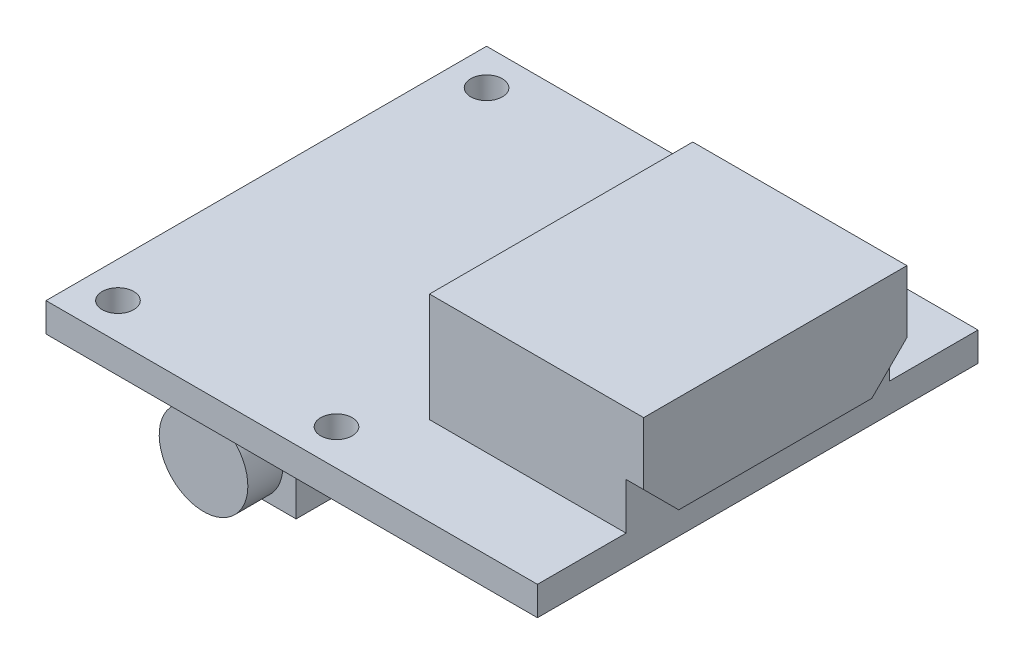
ISO-10303-21;
HEADER;
FILE_DESCRIPTION(('STEP AP214'),'2;1');
FILE_NAME('part.step','',(''),(''),'','','');
FILE_SCHEMA(('AUTOMOTIVE_DESIGN { 1 0 10303 214 1 1 1 1 }'));
ENDSEC;
DATA;
#1=APPLICATION_CONTEXT('core data for automotive mechanical design processes');
#2=APPLICATION_PROTOCOL_DEFINITION('international standard','automotive_design',2000,#1);
#3=PRODUCT_CONTEXT('',#1,'mechanical');
#4=PRODUCT('Part','Part','',(#3));
#5=PRODUCT_RELATED_PRODUCT_CATEGORY('part','',(#4));
#6=PRODUCT_DEFINITION_FORMATION('','',#4);
#7=PRODUCT_DEFINITION_CONTEXT('part definition',#1,'design');
#8=PRODUCT_DEFINITION('design','',#6,#7);
#9=PRODUCT_DEFINITION_SHAPE('','',#8);
#10=(LENGTH_UNIT() NAMED_UNIT(*) SI_UNIT(.MILLI.,.METRE.));
#11=(NAMED_UNIT(*) PLANE_ANGLE_UNIT() SI_UNIT($,.RADIAN.));
#12=(NAMED_UNIT(*) SI_UNIT($,.STERADIAN.) SOLID_ANGLE_UNIT());
#13=UNCERTAINTY_MEASURE_WITH_UNIT(LENGTH_MEASURE(1.E-05),#10,'distance_accuracy_value','');
#14=(GEOMETRIC_REPRESENTATION_CONTEXT(3) GLOBAL_UNCERTAINTY_ASSIGNED_CONTEXT((#13)) GLOBAL_UNIT_ASSIGNED_CONTEXT((#10,
#11,#12)) REPRESENTATION_CONTEXT('',''));
#15=CARTESIAN_POINT('',(0.,0.,0.));
#16=DIRECTION('',(0.,0.,1.));
#17=DIRECTION('',(1.,0.,0.));
#18=AXIS2_PLACEMENT_3D('',#15,#16,#17);
#19=CARTESIAN_POINT('',(0.,0.,0.));
#20=DIRECTION('',(0.,-1.,0.));
#21=DIRECTION('',(0.,0.,-1.));
#22=AXIS2_PLACEMENT_3D('',#19,#20,#21);
#23=PLANE('',#22);
#24=CARTESIAN_POINT('',(-11.95,0.,10.5));
#25=DIRECTION('',(0.,-1.,0.));
#26=DIRECTION('',(0.,0.,-1.));
#27=AXIS2_PLACEMENT_3D('',#24,#25,#26);
#28=CIRCLE('',#27,0.9);
#29=CARTESIAN_POINT('',(-11.95,0.,9.59999999999999));
#30=VERTEX_POINT('',#29);
#31=EDGE_CURVE('E601',#30,#30,#28,.T.);
#32=ORIENTED_EDGE('',*,*,#31,.F.);
#33=EDGE_LOOP('',(#32));
#34=FACE_BOUND('',#33,.T.);
#35=CARTESIAN_POINT('',(0.500000000000002,0.,-10.5));
#36=DIRECTION('',(0.,-1.,0.));
#37=DIRECTION('',(0.,0.,-1.));
#38=AXIS2_PLACEMENT_3D('',#35,#36,#37);
#39=CIRCLE('',#38,0.899999999999999);
#40=CARTESIAN_POINT('',(0.500000000000002,0.,-11.4));
#41=VERTEX_POINT('',#40);
#42=EDGE_CURVE('E598',#41,#41,#39,.T.);
#43=ORIENTED_EDGE('',*,*,#42,.F.);
#44=EDGE_LOOP('',(#43));
#45=FACE_BOUND('',#44,.T.);
#46=CARTESIAN_POINT('',(0.500000000000002,0.,10.5));
#47=DIRECTION('',(0.,-1.,0.));
#48=DIRECTION('',(0.,0.,-1.));
#49=AXIS2_PLACEMENT_3D('',#46,#47,#48);
#50=CIRCLE('',#49,0.9);
#51=CARTESIAN_POINT('',(0.500000000000002,0.,9.6));
#52=VERTEX_POINT('',#51);
#53=EDGE_CURVE('E591',#52,#52,#50,.T.);
#54=ORIENTED_EDGE('',*,*,#53,.F.);
#55=EDGE_LOOP('',(#54));
#56=FACE_BOUND('',#55,.T.);
#57=CARTESIAN_POINT('',(-11.95,0.,-10.5));
#58=DIRECTION('',(0.,-1.,0.));
#59=DIRECTION('',(0.,0.,-1.));
#60=AXIS2_PLACEMENT_3D('',#57,#58,#59);
#61=CIRCLE('',#60,0.9);
#62=CARTESIAN_POINT('',(-11.95,0.,-11.4));
#63=VERTEX_POINT('',#62);
#64=EDGE_CURVE('E302',#63,#63,#61,.T.);
#65=ORIENTED_EDGE('',*,*,#64,.F.);
#66=EDGE_LOOP('',(#65));
#67=FACE_BOUND('',#66,.T.);
#68=DIRECTION('',(0.,0.,-1.));
#69=VECTOR('',#68,1.);
#70=CARTESIAN_POINT('',(14.,0.,12.55));
#71=LINE('',#70,#69);
#72=CARTESIAN_POINT('',(14.,0.,12.55));
#73=VERTEX_POINT('',#72);
#74=CARTESIAN_POINT('',(14.,0.,-12.55));
#75=VERTEX_POINT('',#74);
#76=EDGE_CURVE('E268',#73,#75,#71,.T.);
#77=ORIENTED_EDGE('',*,*,#76,.F.);
#78=DIRECTION('',(1.,0.,0.));
#79=VECTOR('',#78,1.);
#80=CARTESIAN_POINT('',(-14.,0.,12.55));
#81=LINE('',#80,#79);
#82=CARTESIAN_POINT('',(-14.,0.,12.55));
#83=VERTEX_POINT('',#82);
#84=EDGE_CURVE('E286',#83,#73,#81,.T.);
#85=ORIENTED_EDGE('',*,*,#84,.F.);
#86=DIRECTION('',(0.,0.,1.));
#87=VECTOR('',#86,1.);
#88=CARTESIAN_POINT('',(-14.,0.,12.55));
#89=LINE('',#88,#87);
#90=CARTESIAN_POINT('',(-14.,0.,-12.55));
#91=VERTEX_POINT('',#90);
#92=EDGE_CURVE('E284',#91,#83,#89,.T.);
#93=ORIENTED_EDGE('',*,*,#92,.F.);
#94=DIRECTION('',(-1.,0.,0.));
#95=VECTOR('',#94,1.);
#96=CARTESIAN_POINT('',(-14.,0.,-12.55));
#97=LINE('',#96,#95);
#98=EDGE_CURVE('E282',#75,#91,#97,.T.);
#99=ORIENTED_EDGE('',*,*,#98,.F.);
#100=EDGE_LOOP('',(#77,#85,#93,#99));
#101=FACE_BOUND('',#100,.T.);
#102=DIRECTION('',(-1.,0.,0.));
#103=VECTOR('',#102,1.);
#104=CARTESIAN_POINT('',(-8.8,0.,10.05));
#105=LINE('',#104,#103);
#106=CARTESIAN_POINT('',(-6.67091666363659,0.,10.05));
#107=VERTEX_POINT('',#106);
#108=CARTESIAN_POINT('',(-8.8,0.,10.05));
#109=VERTEX_POINT('',#108);
#110=EDGE_CURVE('E188',#107,#109,#105,.T.);
#111=ORIENTED_EDGE('',*,*,#110,.F.);
#112=DIRECTION('',(0.,0.,-1.));
#113=VECTOR('',#112,1.);
#114=CARTESIAN_POINT('',(-6.67091666363659,0.,12.05));
#115=LINE('',#114,#113);
#116=CARTESIAN_POINT('',(-6.67091666363659,0.,12.05));
#117=VERTEX_POINT('',#116);
#118=EDGE_CURVE('E183',#107,#117,#115,.F.);
#119=ORIENTED_EDGE('',*,*,#118,.T.);
#120=DIRECTION('',(-1.,0.,0.));
#121=VECTOR('',#120,1.);
#122=CARTESIAN_POINT('',(0.,0.,12.05));
#123=LINE('',#122,#121);
#124=CARTESIAN_POINT('',(-4.37908333636342,0.,12.05));
#125=VERTEX_POINT('',#124);
#126=EDGE_CURVE('E11',#125,#117,#123,.T.);
#127=ORIENTED_EDGE('',*,*,#126,.F.);
#128=DIRECTION('',(0.,0.,-1.));
#129=VECTOR('',#128,1.);
#130=CARTESIAN_POINT('',(-4.37908333636342,0.,12.05));
#131=LINE('',#130,#129);
#132=CARTESIAN_POINT('',(-4.37908333636342,0.,10.05));
#133=VERTEX_POINT('',#132);
#134=EDGE_CURVE('E171',#125,#133,#131,.T.);
#135=ORIENTED_EDGE('',*,*,#134,.T.);
#136=CARTESIAN_POINT('',(-2.25,0.,10.05));
#137=VERTEX_POINT('',#136);
#138=EDGE_CURVE('E181',#137,#133,#105,.T.);
#139=ORIENTED_EDGE('',*,*,#138,.F.);
#140=DIRECTION('',(0.,0.,1.));
#141=VECTOR('',#140,1.);
#142=CARTESIAN_POINT('',(-2.25,0.,10.05));
#143=LINE('',#142,#141);
#144=CARTESIAN_POINT('',(-2.25,0.,-1.9));
#145=VERTEX_POINT('',#144);
#146=EDGE_CURVE('E193',#145,#137,#143,.T.);
#147=ORIENTED_EDGE('',*,*,#146,.F.);
#148=DIRECTION('',(1.,0.,0.));
#149=VECTOR('',#148,1.);
#150=CARTESIAN_POINT('',(-8.8,0.,-1.9));
#151=LINE('',#150,#149);
#152=CARTESIAN_POINT('',(-8.8,0.,-1.9));
#153=VERTEX_POINT('',#152);
#154=EDGE_CURVE('E617',#153,#145,#151,.T.);
#155=ORIENTED_EDGE('',*,*,#154,.F.);
#156=DIRECTION('',(0.,0.,-1.));
#157=VECTOR('',#156,1.);
#158=CARTESIAN_POINT('',(-8.8,0.,10.05));
#159=LINE('',#158,#157);
#160=EDGE_CURVE('E608',#109,#153,#159,.T.);
#161=ORIENTED_EDGE('',*,*,#160,.F.);
#162=EDGE_LOOP('',(#111,#119,#127,#135,#139,#147,#155,#161));
#163=FACE_BOUND('',#162,.T.);
#164=ADVANCED_FACE('F34',(#34,#45,#56,#67,#101,#163),#23,.T.);
#165=CARTESIAN_POINT('',(-8.8,-4.5,10.05));
#166=DIRECTION('',(0.,0.,-1.));
#167=DIRECTION('',(-1.,0.,0.));
#168=AXIS2_PLACEMENT_3D('',#165,#166,#167);
#169=PLANE('',#168);
#170=CARTESIAN_POINT('',(-5.525,-2.25,10.05));
#171=DIRECTION('',(0.,0.,1.));
#172=DIRECTION('',(1.,0.,0.));
#173=AXIS2_PLACEMENT_3D('',#170,#171,#172);
#174=CIRCLE('',#173,2.525);
#175=CARTESIAN_POINT('',(-4.37908333636342,-4.5,10.05));
#176=VERTEX_POINT('',#175);
#177=EDGE_CURVE('E167',#176,#133,#174,.T.);
#178=ORIENTED_EDGE('',*,*,#177,.F.);
#179=DIRECTION('',(-1.,0.,0.));
#180=VECTOR('',#179,1.);
#181=CARTESIAN_POINT('',(-8.8,-4.5,10.05));
#182=LINE('',#181,#180);
#183=CARTESIAN_POINT('',(-2.25,-4.5,10.05));
#184=VERTEX_POINT('',#183);
#185=EDGE_CURVE('E200',#184,#176,#182,.T.);
#186=ORIENTED_EDGE('',*,*,#185,.F.);
#187=DIRECTION('',(0.,1.,0.));
#188=VECTOR('',#187,1.);
#189=CARTESIAN_POINT('',(-2.25,-4.5,10.05));
#190=LINE('',#189,#188);
#191=EDGE_CURVE('E59',#184,#137,#190,.T.);
#192=ORIENTED_EDGE('',*,*,#191,.T.);
#193=ORIENTED_EDGE('',*,*,#138,.T.);
#194=EDGE_LOOP('',(#178,#186,#192,#193));
#195=FACE_BOUND('',#194,.T.);
#196=ADVANCED_FACE('F186',(#195),#169,.F.);
#197=CARTESIAN_POINT('',(14.,1.65,12.55));
#198=DIRECTION('',(-1.,0.,0.));
#199=DIRECTION('',(0.,0.,1.));
#200=AXIS2_PLACEMENT_3D('',#197,#198,#199);
#201=PLANE('',#200);
#202=DIRECTION('',(0.,-0.707106781186549,-0.707106781186546));
#203=VECTOR('',#202,1.);
#204=CARTESIAN_POINT('',(14.,4.30000000000001,7.5));
#205=LINE('',#204,#203);
#206=CARTESIAN_POINT('',(14.,4.3,7.5));
#207=VERTEX_POINT('',#206);
#208=CARTESIAN_POINT('',(14.,2.3,5.5));
#209=VERTEX_POINT('',#208);
#210=EDGE_CURVE('E207',#207,#209,#205,.T.);
#211=ORIENTED_EDGE('',*,*,#210,.F.);
#212=DIRECTION('',(0.,-1.,0.));
#213=VECTOR('',#212,1.);
#214=CARTESIAN_POINT('',(14.,7.85,7.5));
#215=LINE('',#214,#213);
#216=CARTESIAN_POINT('',(14.,1.65,7.5));
#217=VERTEX_POINT('',#216);
#218=EDGE_CURVE('E251',#207,#217,#215,.T.);
#219=ORIENTED_EDGE('',*,*,#218,.T.);
#220=DIRECTION('',(0.,0.,-1.));
#221=VECTOR('',#220,1.);
#222=CARTESIAN_POINT('',(14.,1.65,12.55));
#223=LINE('',#222,#221);
#224=CARTESIAN_POINT('',(14.,1.65,12.55));
#225=VERTEX_POINT('',#224);
#226=EDGE_CURVE('E269',#225,#217,#223,.T.);
#227=ORIENTED_EDGE('',*,*,#226,.F.);
#228=DIRECTION('',(0.,-1.,0.));
#229=VECTOR('',#228,1.);
#230=CARTESIAN_POINT('',(14.,1.65,12.55));
#231=LINE('',#230,#229);
#232=EDGE_CURVE('E279',#225,#73,#231,.T.);
#233=ORIENTED_EDGE('',*,*,#232,.T.);
#234=ORIENTED_EDGE('',*,*,#76,.T.);
#235=DIRECTION('',(0.,-1.,0.));
#236=VECTOR('',#235,1.);
#237=CARTESIAN_POINT('',(14.,1.65,-12.55));
#238=LINE('',#237,#236);
#239=CARTESIAN_POINT('',(14.,1.65,-12.55));
#240=VERTEX_POINT('',#239);
#241=EDGE_CURVE('E43',#240,#75,#238,.T.);
#242=ORIENTED_EDGE('',*,*,#241,.F.);
#243=CARTESIAN_POINT('',(14.,1.65,-7.5));
#244=VERTEX_POINT('',#243);
#245=EDGE_CURVE('E273',#244,#240,#223,.T.);
#246=ORIENTED_EDGE('',*,*,#245,.F.);
#247=DIRECTION('',(0.,-1.,0.));
#248=VECTOR('',#247,1.);
#249=CARTESIAN_POINT('',(14.,7.85,-7.5));
#250=LINE('',#249,#248);
#251=CARTESIAN_POINT('',(14.,4.3,-7.5));
#252=VERTEX_POINT('',#251);
#253=EDGE_CURVE('E266',#252,#244,#250,.T.);
#254=ORIENTED_EDGE('',*,*,#253,.F.);
#255=DIRECTION('',(0.,0.707106781186549,-0.707106781186546));
#256=VECTOR('',#255,1.);
#257=CARTESIAN_POINT('',(14.,2.3,-5.5));
#258=LINE('',#257,#256);
#259=CARTESIAN_POINT('',(14.,2.3,-5.5));
#260=VERTEX_POINT('',#259);
#261=EDGE_CURVE('E212',#260,#252,#258,.T.);
#262=ORIENTED_EDGE('',*,*,#261,.F.);
#263=DIRECTION('',(0.,0.,-1.));
#264=VECTOR('',#263,1.);
#265=CARTESIAN_POINT('',(14.,2.3,5.5));
#266=LINE('',#265,#264);
#267=EDGE_CURVE('E227',#209,#260,#266,.T.);
#268=ORIENTED_EDGE('',*,*,#267,.F.);
#269=EDGE_LOOP('',(#211,#219,#227,#233,#234,#242,#246,#254,#262,#268));
#270=FACE_BOUND('',#269,.T.);
#271=ADVANCED_FACE('F36',(#270),#201,.F.);
#272=CARTESIAN_POINT('',(0.,1.65,0.));
#273=DIRECTION('',(0.,-1.,0.));
#274=DIRECTION('',(0.,0.,-1.));
#275=AXIS2_PLACEMENT_3D('',#272,#273,#274);
#276=PLANE('',#275);
#277=CARTESIAN_POINT('',(-11.95,1.65,10.5));
#278=DIRECTION('',(0.,-1.,0.));
#279=DIRECTION('',(0.,0.,-1.));
#280=AXIS2_PLACEMENT_3D('',#277,#278,#279);
#281=CIRCLE('',#280,0.9);
#282=CARTESIAN_POINT('',(-11.95,1.65,9.59999999999999));
#283=VERTEX_POINT('',#282);
#284=EDGE_CURVE('E38',#283,#283,#281,.T.);
#285=ORIENTED_EDGE('',*,*,#284,.T.);
#286=EDGE_LOOP('',(#285));
#287=FACE_BOUND('',#286,.T.);
#288=CARTESIAN_POINT('',(0.500000000000002,1.65,-10.5));
#289=DIRECTION('',(0.,-1.,0.));
#290=DIRECTION('',(0.,0.,-1.));
#291=AXIS2_PLACEMENT_3D('',#288,#289,#290);
#292=CIRCLE('',#291,0.899999999999999);
#293=CARTESIAN_POINT('',(0.500000000000002,1.65,-11.4));
#294=VERTEX_POINT('',#293);
#295=EDGE_CURVE('E304',#294,#294,#292,.T.);
#296=ORIENTED_EDGE('',*,*,#295,.T.);
#297=EDGE_LOOP('',(#296));
#298=FACE_BOUND('',#297,.T.);
#299=CARTESIAN_POINT('',(0.500000000000002,1.65,10.5));
#300=DIRECTION('',(0.,-1.,0.));
#301=DIRECTION('',(0.,0.,-1.));
#302=AXIS2_PLACEMENT_3D('',#299,#300,#301);
#303=CIRCLE('',#302,0.9);
#304=CARTESIAN_POINT('',(0.500000000000002,1.65,9.6));
#305=VERTEX_POINT('',#304);
#306=EDGE_CURVE('E301',#305,#305,#303,.T.);
#307=ORIENTED_EDGE('',*,*,#306,.T.);
#308=EDGE_LOOP('',(#307));
#309=FACE_BOUND('',#308,.T.);
#310=CARTESIAN_POINT('',(-11.95,1.65,-10.5));
#311=DIRECTION('',(0.,-1.,0.));
#312=DIRECTION('',(0.,0.,-1.));
#313=AXIS2_PLACEMENT_3D('',#310,#311,#312);
#314=CIRCLE('',#313,0.9);
#315=CARTESIAN_POINT('',(-11.95,1.65,-11.4));
#316=VERTEX_POINT('',#315);
#317=EDGE_CURVE('E298',#316,#316,#314,.T.);
#318=ORIENTED_EDGE('',*,*,#317,.T.);
#319=EDGE_LOOP('',(#318));
#320=FACE_BOUND('',#319,.T.);
#321=DIRECTION('',(1.,0.,0.));
#322=VECTOR('',#321,1.);
#323=CARTESIAN_POINT('',(14.,1.65,7.5));
#324=LINE('',#323,#322);
#325=CARTESIAN_POINT('',(2.8,1.65,7.5));
#326=VERTEX_POINT('',#325);
#327=EDGE_CURVE('E247',#326,#217,#324,.T.);
#328=ORIENTED_EDGE('',*,*,#327,.F.);
#329=DIRECTION('',(0.,0.,1.));
#330=VECTOR('',#329,1.);
#331=CARTESIAN_POINT('',(2.8,1.65,-7.5));
#332=LINE('',#331,#330);
#333=CARTESIAN_POINT('',(2.8,1.65,-7.5));
#334=VERTEX_POINT('',#333);
#335=EDGE_CURVE('E254',#334,#326,#332,.T.);
#336=ORIENTED_EDGE('',*,*,#335,.F.);
#337=DIRECTION('',(-1.,0.,0.));
#338=VECTOR('',#337,1.);
#339=CARTESIAN_POINT('',(14.,1.65,-7.5));
#340=LINE('',#339,#338);
#341=EDGE_CURVE('E243',#244,#334,#340,.T.);
#342=ORIENTED_EDGE('',*,*,#341,.F.);
#343=ORIENTED_EDGE('',*,*,#245,.T.);
#344=DIRECTION('',(-1.,0.,0.));
#345=VECTOR('',#344,1.);
#346=CARTESIAN_POINT('',(-14.,1.65,-12.55));
#347=LINE('',#346,#345);
#348=CARTESIAN_POINT('',(-14.,1.65,-12.55));
#349=VERTEX_POINT('',#348);
#350=EDGE_CURVE('E272',#240,#349,#347,.T.);
#351=ORIENTED_EDGE('',*,*,#350,.T.);
#352=DIRECTION('',(0.,0.,1.));
#353=VECTOR('',#352,1.);
#354=CARTESIAN_POINT('',(-14.,1.65,12.55));
#355=LINE('',#354,#353);
#356=CARTESIAN_POINT('',(-14.,1.65,12.55));
#357=VERTEX_POINT('',#356);
#358=EDGE_CURVE('E275',#349,#357,#355,.T.);
#359=ORIENTED_EDGE('',*,*,#358,.T.);
#360=DIRECTION('',(1.,0.,0.));
#361=VECTOR('',#360,1.);
#362=CARTESIAN_POINT('',(-14.,1.65,12.55));
#363=LINE('',#362,#361);
#364=EDGE_CURVE('E277',#357,#225,#363,.T.);
#365=ORIENTED_EDGE('',*,*,#364,.T.);
#366=ORIENTED_EDGE('',*,*,#226,.T.);
#367=EDGE_LOOP('',(#328,#336,#342,#343,#351,#359,#365,#366));
#368=FACE_BOUND('',#367,.T.);
#369=ADVANCED_FACE('F311',(#287,#298,#309,#320,#368),#276,.F.);
#370=CARTESIAN_POINT('',(-14.,1.65,-12.55));
#371=DIRECTION('',(0.,0.,1.));
#372=DIRECTION('',(1.,0.,0.));
#373=AXIS2_PLACEMENT_3D('',#370,#371,#372);
#374=PLANE('',#373);
#375=ORIENTED_EDGE('',*,*,#98,.T.);
#376=DIRECTION('',(0.,-1.,0.));
#377=VECTOR('',#376,1.);
#378=CARTESIAN_POINT('',(-14.,1.65,-12.55));
#379=LINE('',#378,#377);
#380=EDGE_CURVE('E293',#349,#91,#379,.T.);
#381=ORIENTED_EDGE('',*,*,#380,.F.);
#382=ORIENTED_EDGE('',*,*,#350,.F.);
#383=ORIENTED_EDGE('',*,*,#241,.T.);
#384=EDGE_LOOP('',(#375,#381,#382,#383));
#385=FACE_BOUND('',#384,.T.);
#386=ADVANCED_FACE('F346',(#385),#374,.F.);
#387=CARTESIAN_POINT('',(-14.,1.65,12.55));
#388=DIRECTION('',(1.,0.,0.));
#389=DIRECTION('',(0.,0.,-1.));
#390=AXIS2_PLACEMENT_3D('',#387,#388,#389);
#391=PLANE('',#390);
#392=ORIENTED_EDGE('',*,*,#92,.T.);
#393=DIRECTION('',(0.,-1.,0.));
#394=VECTOR('',#393,1.);
#395=CARTESIAN_POINT('',(-14.,1.65,12.55));
#396=LINE('',#395,#394);
#397=EDGE_CURVE('E290',#357,#83,#396,.T.);
#398=ORIENTED_EDGE('',*,*,#397,.F.);
#399=ORIENTED_EDGE('',*,*,#358,.F.);
#400=ORIENTED_EDGE('',*,*,#380,.T.);
#401=EDGE_LOOP('',(#392,#398,#399,#400));
#402=FACE_BOUND('',#401,.T.);
#403=ADVANCED_FACE('F343',(#402),#391,.F.);
#404=CARTESIAN_POINT('',(-14.,1.65,12.55));
#405=DIRECTION('',(0.,0.,-1.));
#406=DIRECTION('',(-1.,0.,0.));
#407=AXIS2_PLACEMENT_3D('',#404,#405,#406);
#408=PLANE('',#407);
#409=ORIENTED_EDGE('',*,*,#84,.T.);
#410=ORIENTED_EDGE('',*,*,#232,.F.);
#411=ORIENTED_EDGE('',*,*,#364,.F.);
#412=ORIENTED_EDGE('',*,*,#397,.T.);
#413=EDGE_LOOP('',(#409,#410,#411,#412));
#414=FACE_BOUND('',#413,.T.);
#415=ADVANCED_FACE('F339',(#414),#408,.F.);
#416=CARTESIAN_POINT('',(14.,7.85,-7.5));
#417=DIRECTION('',(0.,0.,1.));
#418=DIRECTION('',(1.,0.,0.));
#419=AXIS2_PLACEMENT_3D('',#416,#417,#418);
#420=PLANE('',#419);
#421=ORIENTED_EDGE('',*,*,#341,.T.);
#422=DIRECTION('',(0.,-1.,0.));
#423=VECTOR('',#422,1.);
#424=CARTESIAN_POINT('',(2.8,7.85,-7.5));
#425=LINE('',#424,#423);
#426=CARTESIAN_POINT('',(2.8,7.85,-7.5));
#427=VERTEX_POINT('',#426);
#428=EDGE_CURVE('E263',#427,#334,#425,.T.);
#429=ORIENTED_EDGE('',*,*,#428,.F.);
#430=DIRECTION('',(-1.,0.,0.));
#431=VECTOR('',#430,1.);
#432=CARTESIAN_POINT('',(14.,7.85,-7.5));
#433=LINE('',#432,#431);
#434=CARTESIAN_POINT('',(15.,7.85,-7.5));
#435=VERTEX_POINT('',#434);
#436=EDGE_CURVE('E244',#435,#427,#433,.T.);
#437=ORIENTED_EDGE('',*,*,#436,.F.);
#438=DIRECTION('',(0.,1.,0.));
#439=VECTOR('',#438,1.);
#440=CARTESIAN_POINT('',(15.,7.85,-7.5));
#441=LINE('',#440,#439);
#442=CARTESIAN_POINT('',(15.,4.3,-7.5));
#443=VERTEX_POINT('',#442);
#444=EDGE_CURVE('E216',#443,#435,#441,.T.);
#445=ORIENTED_EDGE('',*,*,#444,.F.);
#446=DIRECTION('',(-1.,0.,0.));
#447=VECTOR('',#446,1.);
#448=CARTESIAN_POINT('',(15.,4.3,-7.5));
#449=LINE('',#448,#447);
#450=EDGE_CURVE('E234',#443,#252,#449,.T.);
#451=ORIENTED_EDGE('',*,*,#450,.T.);
#452=ORIENTED_EDGE('',*,*,#253,.T.);
#453=EDGE_LOOP('',(#421,#429,#437,#445,#451,#452));
#454=FACE_BOUND('',#453,.T.);
#455=ADVANCED_FACE('F342',(#454),#420,.F.);
#456=CARTESIAN_POINT('',(2.8,7.85,-7.5));
#457=DIRECTION('',(1.,0.,0.));
#458=DIRECTION('',(0.,0.,-1.));
#459=AXIS2_PLACEMENT_3D('',#456,#457,#458);
#460=PLANE('',#459);
#461=ORIENTED_EDGE('',*,*,#335,.T.);
#462=DIRECTION('',(0.,-1.,0.));
#463=VECTOR('',#462,1.);
#464=CARTESIAN_POINT('',(2.8,7.85,7.5));
#465=LINE('',#464,#463);
#466=CARTESIAN_POINT('',(2.8,7.85,7.5));
#467=VERTEX_POINT('',#466);
#468=EDGE_CURVE('E260',#467,#326,#465,.T.);
#469=ORIENTED_EDGE('',*,*,#468,.F.);
#470=DIRECTION('',(0.,0.,1.));
#471=VECTOR('',#470,1.);
#472=CARTESIAN_POINT('',(2.8,7.85,-7.5));
#473=LINE('',#472,#471);
#474=EDGE_CURVE('E246',#427,#467,#473,.T.);
#475=ORIENTED_EDGE('',*,*,#474,.F.);
#476=ORIENTED_EDGE('',*,*,#428,.T.);
#477=EDGE_LOOP('',(#461,#469,#475,#476));
#478=FACE_BOUND('',#477,.T.);
#479=ADVANCED_FACE('F376',(#478),#460,.F.);
#480=CARTESIAN_POINT('',(14.,7.85,7.5));
#481=DIRECTION('',(0.,0.,-1.));
#482=DIRECTION('',(-1.,0.,0.));
#483=AXIS2_PLACEMENT_3D('',#480,#481,#482);
#484=PLANE('',#483);
#485=ORIENTED_EDGE('',*,*,#327,.T.);
#486=ORIENTED_EDGE('',*,*,#218,.F.);
#487=DIRECTION('',(-1.,0.,0.));
#488=VECTOR('',#487,1.);
#489=CARTESIAN_POINT('',(15.,4.30000000000001,7.5));
#490=LINE('',#489,#488);
#491=CARTESIAN_POINT('',(15.,4.30000000000001,7.5));
#492=VERTEX_POINT('',#491);
#493=EDGE_CURVE('E224',#492,#207,#490,.T.);
#494=ORIENTED_EDGE('',*,*,#493,.F.);
#495=DIRECTION('',(0.,-1.,0.));
#496=VECTOR('',#495,1.);
#497=CARTESIAN_POINT('',(15.,4.30000000000001,7.5));
#498=LINE('',#497,#496);
#499=CARTESIAN_POINT('',(15.,7.85,7.5));
#500=VERTEX_POINT('',#499);
#501=EDGE_CURVE('E222',#500,#492,#498,.T.);
#502=ORIENTED_EDGE('',*,*,#501,.F.);
#503=DIRECTION('',(1.,0.,0.));
#504=VECTOR('',#503,1.);
#505=CARTESIAN_POINT('',(14.,7.85,7.5));
#506=LINE('',#505,#504);
#507=EDGE_CURVE('E249',#467,#500,#506,.T.);
#508=ORIENTED_EDGE('',*,*,#507,.F.);
#509=ORIENTED_EDGE('',*,*,#468,.T.);
#510=EDGE_LOOP('',(#485,#486,#494,#502,#508,#509));
#511=FACE_BOUND('',#510,.T.);
#512=ADVANCED_FACE('F369',(#511),#484,.F.);
#513=CARTESIAN_POINT('',(0.,7.85,0.));
#514=DIRECTION('',(0.,-1.,0.));
#515=DIRECTION('',(0.,0.,-1.));
#516=AXIS2_PLACEMENT_3D('',#513,#514,#515);
#517=PLANE('',#516);
#518=ORIENTED_EDGE('',*,*,#507,.T.);
#519=DIRECTION('',(0.,0.,1.));
#520=VECTOR('',#519,1.);
#521=CARTESIAN_POINT('',(15.,7.85,7.5));
#522=LINE('',#521,#520);
#523=EDGE_CURVE('E219',#435,#500,#522,.T.);
#524=ORIENTED_EDGE('',*,*,#523,.F.);
#525=ORIENTED_EDGE('',*,*,#436,.T.);
#526=ORIENTED_EDGE('',*,*,#474,.T.);
#527=EDGE_LOOP('',(#518,#524,#525,#526));
#528=FACE_BOUND('',#527,.T.);
#529=ADVANCED_FACE('F397',(#528),#517,.F.);
#530=CARTESIAN_POINT('',(15.,4.30000000000001,7.5));
#531=DIRECTION('',(0.,0.707106781186546,-0.707106781186549));
#532=DIRECTION('',(0.,0.707106781186549,0.707106781186546));
#533=AXIS2_PLACEMENT_3D('',#530,#531,#532);
#534=PLANE('',#533);
#535=ORIENTED_EDGE('',*,*,#210,.T.);
#536=DIRECTION('',(-1.,0.,0.));
#537=VECTOR('',#536,1.);
#538=CARTESIAN_POINT('',(15.,2.3,5.5));
#539=LINE('',#538,#537);
#540=CARTESIAN_POINT('',(15.,2.3,5.5));
#541=VERTEX_POINT('',#540);
#542=EDGE_CURVE('E240',#541,#209,#539,.T.);
#543=ORIENTED_EDGE('',*,*,#542,.F.);
#544=DIRECTION('',(0.,-0.707106781186549,-0.707106781186546));
#545=VECTOR('',#544,1.);
#546=CARTESIAN_POINT('',(15.,4.30000000000001,7.5));
#547=LINE('',#546,#545);
#548=EDGE_CURVE('E208',#492,#541,#547,.T.);
#549=ORIENTED_EDGE('',*,*,#548,.F.);
#550=ORIENTED_EDGE('',*,*,#493,.T.);
#551=EDGE_LOOP('',(#535,#543,#549,#550));
#552=FACE_BOUND('',#551,.T.);
#553=ADVANCED_FACE('F391',(#552),#534,.F.);
#554=CARTESIAN_POINT('',(15.,2.3,5.5));
#555=DIRECTION('',(0.,1.,0.));
#556=DIRECTION('',(0.,0.,1.));
#557=AXIS2_PLACEMENT_3D('',#554,#555,#556);
#558=PLANE('',#557);
#559=ORIENTED_EDGE('',*,*,#267,.T.);
#560=DIRECTION('',(-1.,0.,0.));
#561=VECTOR('',#560,1.);
#562=CARTESIAN_POINT('',(15.,2.3,-5.5));
#563=LINE('',#562,#561);
#564=CARTESIAN_POINT('',(15.,2.3,-5.5));
#565=VERTEX_POINT('',#564);
#566=EDGE_CURVE('E237',#565,#260,#563,.T.);
#567=ORIENTED_EDGE('',*,*,#566,.F.);
#568=DIRECTION('',(0.,0.,-1.));
#569=VECTOR('',#568,1.);
#570=CARTESIAN_POINT('',(15.,2.3,5.5));
#571=LINE('',#570,#569);
#572=EDGE_CURVE('E211',#541,#565,#571,.T.);
#573=ORIENTED_EDGE('',*,*,#572,.F.);
#574=ORIENTED_EDGE('',*,*,#542,.T.);
#575=EDGE_LOOP('',(#559,#567,#573,#574));
#576=FACE_BOUND('',#575,.T.);
#577=ADVANCED_FACE('F388',(#576),#558,.F.);
#578=CARTESIAN_POINT('',(15.,2.3,-5.5));
#579=DIRECTION('',(0.,0.707106781186546,0.707106781186549));
#580=DIRECTION('',(0.,-0.707106781186549,0.707106781186546));
#581=AXIS2_PLACEMENT_3D('',#578,#579,#580);
#582=PLANE('',#581);
#583=ORIENTED_EDGE('',*,*,#261,.T.);
#584=ORIENTED_EDGE('',*,*,#450,.F.);
#585=DIRECTION('',(0.,0.707106781186549,-0.707106781186546));
#586=VECTOR('',#585,1.);
#587=CARTESIAN_POINT('',(15.,2.3,-5.5));
#588=LINE('',#587,#586);
#589=EDGE_CURVE('E214',#565,#443,#588,.T.);
#590=ORIENTED_EDGE('',*,*,#589,.F.);
#591=ORIENTED_EDGE('',*,*,#566,.T.);
#592=EDGE_LOOP('',(#583,#584,#590,#591));
#593=FACE_BOUND('',#592,.T.);
#594=ADVANCED_FACE('F384',(#593),#582,.F.);
#595=CARTESIAN_POINT('',(15.,0.,0.));
#596=DIRECTION('',(1.,0.,0.));
#597=DIRECTION('',(0.,0.,-1.));
#598=AXIS2_PLACEMENT_3D('',#595,#596,#597);
#599=PLANE('',#598);
#600=ORIENTED_EDGE('',*,*,#548,.T.);
#601=ORIENTED_EDGE('',*,*,#572,.T.);
#602=ORIENTED_EDGE('',*,*,#589,.T.);
#603=ORIENTED_EDGE('',*,*,#444,.T.);
#604=ORIENTED_EDGE('',*,*,#523,.T.);
#605=ORIENTED_EDGE('',*,*,#501,.T.);
#606=EDGE_LOOP('',(#600,#601,#602,#603,#604,#605));
#607=FACE_BOUND('',#606,.T.);
#608=ADVANCED_FACE('F394',(#607),#599,.T.);
#609=CARTESIAN_POINT('',(-8.8,-4.5,10.05));
#610=DIRECTION('',(1.,0.,0.));
#611=DIRECTION('',(0.,0.,-1.));
#612=AXIS2_PLACEMENT_3D('',#609,#610,#611);
#613=PLANE('',#612);
#614=ORIENTED_EDGE('',*,*,#160,.T.);
#615=DIRECTION('',(0.,1.,0.));
#616=VECTOR('',#615,1.);
#617=CARTESIAN_POINT('',(-8.8,-4.5,-1.9));
#618=LINE('',#617,#616);
#619=CARTESIAN_POINT('',(-8.8,-4.5,-1.9));
#620=VERTEX_POINT('',#619);
#621=EDGE_CURVE('E205',#620,#153,#618,.T.);
#622=ORIENTED_EDGE('',*,*,#621,.F.);
#623=DIRECTION('',(0.,0.,-1.));
#624=VECTOR('',#623,1.);
#625=CARTESIAN_POINT('',(-8.8,-4.5,10.05));
#626=LINE('',#625,#624);
#627=CARTESIAN_POINT('',(-8.8,-4.5,10.05));
#628=VERTEX_POINT('',#627);
#629=EDGE_CURVE('E187',#628,#620,#626,.T.);
#630=ORIENTED_EDGE('',*,*,#629,.F.);
#631=DIRECTION('',(0.,1.,0.));
#632=VECTOR('',#631,1.);
#633=CARTESIAN_POINT('',(-8.8,-4.5,10.05));
#634=LINE('',#633,#632);
#635=EDGE_CURVE('E197',#628,#109,#634,.T.);
#636=ORIENTED_EDGE('',*,*,#635,.T.);
#637=EDGE_LOOP('',(#614,#622,#630,#636));
#638=FACE_BOUND('',#637,.T.);
#639=ADVANCED_FACE('F459',(#638),#613,.F.);
#640=CARTESIAN_POINT('',(-8.8,-4.5,-1.9));
#641=DIRECTION('',(0.,0.,1.));
#642=DIRECTION('',(1.,0.,0.));
#643=AXIS2_PLACEMENT_3D('',#640,#641,#642);
#644=PLANE('',#643);
#645=ORIENTED_EDGE('',*,*,#154,.T.);
#646=DIRECTION('',(0.,1.,0.));
#647=VECTOR('',#646,1.);
#648=CARTESIAN_POINT('',(-2.25,-4.5,-1.9));
#649=LINE('',#648,#647);
#650=CARTESIAN_POINT('',(-2.25,-4.5,-1.9));
#651=VERTEX_POINT('',#650);
#652=EDGE_CURVE('E202',#651,#145,#649,.T.);
#653=ORIENTED_EDGE('',*,*,#652,.F.);
#654=DIRECTION('',(1.,0.,0.));
#655=VECTOR('',#654,1.);
#656=CARTESIAN_POINT('',(-8.8,-4.5,-1.9));
#657=LINE('',#656,#655);
#658=EDGE_CURVE('E191',#620,#651,#657,.T.);
#659=ORIENTED_EDGE('',*,*,#658,.F.);
#660=ORIENTED_EDGE('',*,*,#621,.T.);
#661=EDGE_LOOP('',(#645,#653,#659,#660));
#662=FACE_BOUND('',#661,.T.);
#663=ADVANCED_FACE('F468',(#662),#644,.F.);
#664=CARTESIAN_POINT('',(-2.25,-4.5,10.05));
#665=DIRECTION('',(-1.,0.,0.));
#666=DIRECTION('',(0.,0.,1.));
#667=AXIS2_PLACEMENT_3D('',#664,#665,#666);
#668=PLANE('',#667);
#669=ORIENTED_EDGE('',*,*,#146,.T.);
#670=ORIENTED_EDGE('',*,*,#191,.F.);
#671=DIRECTION('',(0.,0.,1.));
#672=VECTOR('',#671,1.);
#673=CARTESIAN_POINT('',(-2.25,-4.5,10.05));
#674=LINE('',#673,#672);
#675=EDGE_CURVE('E611',#651,#184,#674,.T.);
#676=ORIENTED_EDGE('',*,*,#675,.F.);
#677=ORIENTED_EDGE('',*,*,#652,.T.);
#678=EDGE_LOOP('',(#669,#670,#676,#677));
#679=FACE_BOUND('',#678,.T.);
#680=ADVANCED_FACE('F478',(#679),#668,.F.);
#681=CARTESIAN_POINT('',(-6.67091666363659,-4.5,10.05));
#682=VERTEX_POINT('',#681);
#683=EDGE_CURVE('E51',#107,#682,#174,.T.);
#684=ORIENTED_EDGE('',*,*,#683,.F.);
#685=ORIENTED_EDGE('',*,*,#110,.T.);
#686=ORIENTED_EDGE('',*,*,#635,.F.);
#687=EDGE_CURVE('E613',#682,#628,#182,.T.);
#688=ORIENTED_EDGE('',*,*,#687,.F.);
#689=EDGE_LOOP('',(#684,#685,#686,#688));
#690=FACE_BOUND('',#689,.T.);
#691=ADVANCED_FACE('F333',(#690),#169,.F.);
#692=CARTESIAN_POINT('',(0.,-4.5,0.));
#693=DIRECTION('',(0.,-1.,0.));
#694=DIRECTION('',(0.,0.,-1.));
#695=AXIS2_PLACEMENT_3D('',#692,#693,#694);
#696=PLANE('',#695);
#697=ORIENTED_EDGE('',*,*,#629,.T.);
#698=ORIENTED_EDGE('',*,*,#658,.T.);
#699=ORIENTED_EDGE('',*,*,#675,.T.);
#700=ORIENTED_EDGE('',*,*,#185,.T.);
#701=EDGE_CURVE('E615',#176,#682,#182,.T.);
#702=ORIENTED_EDGE('',*,*,#701,.T.);
#703=ORIENTED_EDGE('',*,*,#687,.T.);
#704=EDGE_LOOP('',(#697,#698,#699,#700,#702,#703));
#705=FACE_BOUND('',#704,.T.);
#706=ADVANCED_FACE('F506',(#705),#696,.T.);
#707=CARTESIAN_POINT('',(-5.525,-2.25,12.05));
#708=DIRECTION('',(0.,0.,-1.));
#709=DIRECTION('',(-1.,0.,0.));
#710=AXIS2_PLACEMENT_3D('',#707,#708,#709);
#711=CYLINDRICAL_SURFACE('',#710,2.525);
#712=ORIENTED_EDGE('',*,*,#118,.F.);
#713=ORIENTED_EDGE('',*,*,#683,.T.);
#714=EDGE_CURVE('E173',#682,#176,#174,.T.);
#715=ORIENTED_EDGE('',*,*,#714,.T.);
#716=ORIENTED_EDGE('',*,*,#177,.T.);
#717=ORIENTED_EDGE('',*,*,#134,.F.);
#718=CARTESIAN_POINT('',(-5.525,-2.25,12.05));
#719=DIRECTION('',(0.,0.,1.));
#720=DIRECTION('',(1.,0.,0.));
#721=AXIS2_PLACEMENT_3D('',#718,#719,#720);
#722=CIRCLE('',#721,2.525);
#723=EDGE_CURVE('E184',#117,#125,#722,.T.);
#724=ORIENTED_EDGE('',*,*,#723,.F.);
#725=EDGE_LOOP('',(#712,#713,#715,#716,#717,#724));
#726=FACE_BOUND('',#725,.T.);
#727=ADVANCED_FACE('F169',(#726),#711,.T.);
#728=CARTESIAN_POINT('',(-5.525,-2.25,12.05));
#729=DIRECTION('',(0.,0.,1.));
#730=DIRECTION('',(1.,0.,0.));
#731=AXIS2_PLACEMENT_3D('',#728,#729,#730);
#732=PLANE('',#731);
#733=ORIENTED_EDGE('',*,*,#723,.T.);
#734=ORIENTED_EDGE('',*,*,#126,.T.);
#735=EDGE_LOOP('',(#733,#734));
#736=FACE_BOUND('',#735,.T.);
#737=ADVANCED_FACE('F523',(#736),#732,.T.);
#738=CARTESIAN_POINT('',(-5.525,-2.25,10.05));
#739=DIRECTION('',(0.,0.,1.));
#740=DIRECTION('',(1.,0.,0.));
#741=AXIS2_PLACEMENT_3D('',#738,#739,#740);
#742=PLANE('',#741);
#743=ORIENTED_EDGE('',*,*,#701,.F.);
#744=ORIENTED_EDGE('',*,*,#714,.F.);
#745=EDGE_LOOP('',(#743,#744));
#746=FACE_BOUND('',#745,.T.);
#747=ADVANCED_FACE('F532',(#746),#742,.F.);
#748=CARTESIAN_POINT('',(-11.95,7.85,-10.5));
#749=DIRECTION('',(0.,-1.,0.));
#750=DIRECTION('',(0.,0.,-1.));
#751=AXIS2_PLACEMENT_3D('',#748,#749,#750);
#752=CYLINDRICAL_SURFACE('',#751,0.9);
#753=ORIENTED_EDGE('',*,*,#64,.T.);
#754=EDGE_LOOP('',(#753));
#755=FACE_BOUND('',#754,.T.);
#756=ORIENTED_EDGE('',*,*,#317,.F.);
#757=EDGE_LOOP('',(#756));
#758=FACE_BOUND('',#757,.T.);
#759=ADVANCED_FACE('F542',(#755,#758),#752,.F.);
#760=CARTESIAN_POINT('',(0.500000000000002,7.85,10.5));
#761=DIRECTION('',(0.,-1.,0.));
#762=DIRECTION('',(0.,0.,-1.));
#763=AXIS2_PLACEMENT_3D('',#760,#761,#762);
#764=CYLINDRICAL_SURFACE('',#763,0.9);
#765=ORIENTED_EDGE('',*,*,#53,.T.);
#766=EDGE_LOOP('',(#765));
#767=FACE_BOUND('',#766,.T.);
#768=ORIENTED_EDGE('',*,*,#306,.F.);
#769=EDGE_LOOP('',(#768));
#770=FACE_BOUND('',#769,.T.);
#771=ADVANCED_FACE('F321',(#767,#770),#764,.F.);
#772=CARTESIAN_POINT('',(0.500000000000002,7.85,-10.5));
#773=DIRECTION('',(0.,-1.,0.));
#774=DIRECTION('',(0.,0.,-1.));
#775=AXIS2_PLACEMENT_3D('',#772,#773,#774);
#776=CYLINDRICAL_SURFACE('',#775,0.899999999999999);
#777=ORIENTED_EDGE('',*,*,#42,.T.);
#778=EDGE_LOOP('',(#777));
#779=FACE_BOUND('',#778,.T.);
#780=ORIENTED_EDGE('',*,*,#295,.F.);
#781=EDGE_LOOP('',(#780));
#782=FACE_BOUND('',#781,.T.);
#783=ADVANCED_FACE('F315',(#779,#782),#776,.F.);
#784=CARTESIAN_POINT('',(-11.95,7.85,10.5));
#785=DIRECTION('',(0.,-1.,0.));
#786=DIRECTION('',(0.,0.,-1.));
#787=AXIS2_PLACEMENT_3D('',#784,#785,#786);
#788=CYLINDRICAL_SURFACE('',#787,0.9);
#789=ORIENTED_EDGE('',*,*,#31,.T.);
#790=EDGE_LOOP('',(#789));
#791=FACE_BOUND('',#790,.T.);
#792=ORIENTED_EDGE('',*,*,#284,.F.);
#793=EDGE_LOOP('',(#792));
#794=FACE_BOUND('',#793,.T.);
#795=ADVANCED_FACE('F313',(#791,#794),#788,.F.);
#796=CLOSED_SHELL('',(#164,#196,#271,#369,#386,#403,#415,#455,#479,#512,#529,#553,#577,#594,
#608,#639,#663,#680,#691,#706,#727,#737,#747,#759,#771,#783,#795));
#797=MANIFOLD_SOLID_BREP('B2',#796);
#798=ADVANCED_BREP_SHAPE_REPRESENTATION('',(#18,#797),#14);
#799=SHAPE_DEFINITION_REPRESENTATION(#9,#798);
ENDSEC;
END-ISO-10303-21;
